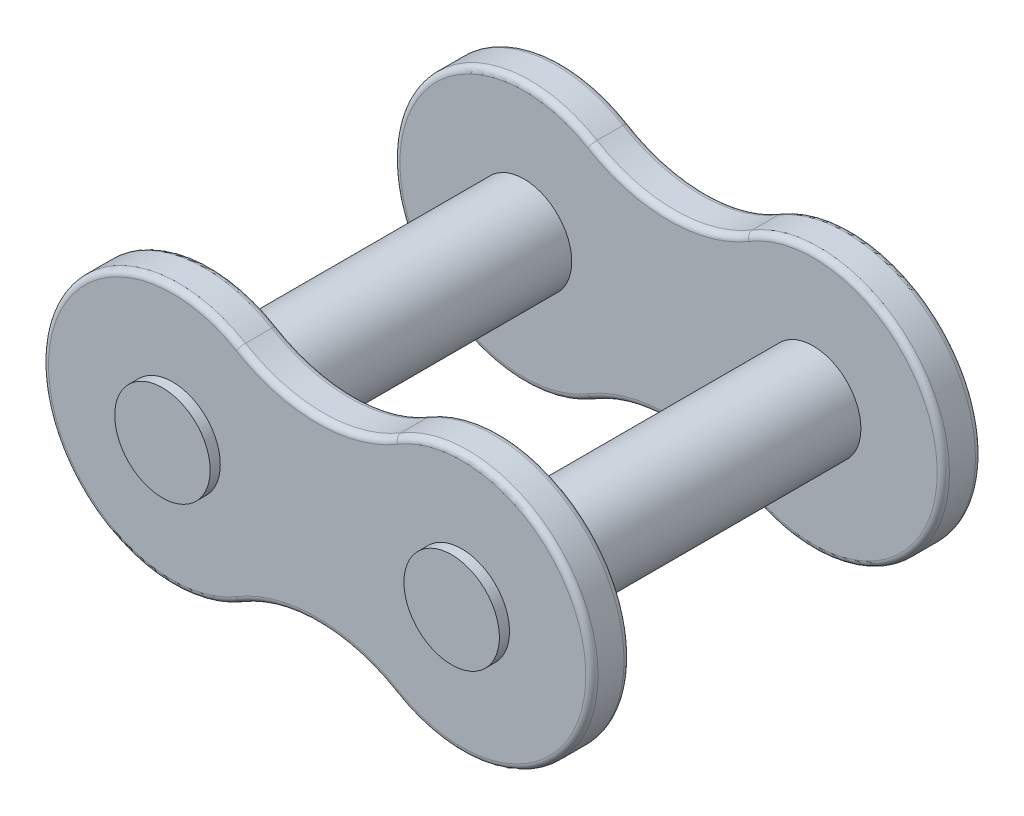
ISO-10303-21;
HEADER;
FILE_DESCRIPTION(('STEP AP214'),'2;1');
FILE_NAME('part.step','',(''),(''),'','','');
FILE_SCHEMA(('AUTOMOTIVE_DESIGN { 1 0 10303 214 1 1 1 1 }'));
ENDSEC;
DATA;
#1=APPLICATION_CONTEXT('core data for automotive mechanical design processes');
#2=APPLICATION_PROTOCOL_DEFINITION('international standard','automotive_design',2000,#1);
#3=PRODUCT_CONTEXT('',#1,'mechanical');
#4=PRODUCT('Part','Part','',(#3));
#5=PRODUCT_RELATED_PRODUCT_CATEGORY('part','',(#4));
#6=PRODUCT_DEFINITION_FORMATION('','',#4);
#7=PRODUCT_DEFINITION_CONTEXT('part definition',#1,'design');
#8=PRODUCT_DEFINITION('design','',#6,#7);
#9=PRODUCT_DEFINITION_SHAPE('','',#8);
#10=(LENGTH_UNIT() NAMED_UNIT(*) SI_UNIT(.MILLI.,.METRE.));
#11=(NAMED_UNIT(*) PLANE_ANGLE_UNIT() SI_UNIT($,.RADIAN.));
#12=(NAMED_UNIT(*) SI_UNIT($,.STERADIAN.) SOLID_ANGLE_UNIT());
#13=UNCERTAINTY_MEASURE_WITH_UNIT(LENGTH_MEASURE(1.E-05),#10,'distance_accuracy_value','');
#14=(GEOMETRIC_REPRESENTATION_CONTEXT(3) GLOBAL_UNCERTAINTY_ASSIGNED_CONTEXT((#13)) GLOBAL_UNIT_ASSIGNED_CONTEXT((#10,
#11,#12)) REPRESENTATION_CONTEXT('',''));
#15=CARTESIAN_POINT('',(0.,0.,0.));
#16=DIRECTION('',(0.,0.,1.));
#17=DIRECTION('',(1.,0.,0.));
#18=AXIS2_PLACEMENT_3D('',#15,#16,#17);
#19=CARTESIAN_POINT('',(-3.,5.00001063335668,1.5875));
#20=DIRECTION('',(0.,0.,-1.));
#21=DIRECTION('',(-1.,0.,0.));
#22=AXIS2_PLACEMENT_3D('',#19,#20,#21);
#23=PLANE('',#22);
#24=CARTESIAN_POINT('',(0.,-10.0000212667134,1.5875));
#25=DIRECTION('',(0.,0.,-1.));
#26=DIRECTION('',(-1.,0.,0.));
#27=AXIS2_PLACEMENT_3D('',#24,#25,#26);
#28=CIRCLE('',#27,6.51592202575199);
#29=CARTESIAN_POINT('',(-3.35240898268576,-4.4126610797836,1.5875));
#30=VERTEX_POINT('',#29);
#31=CARTESIAN_POINT('',(3.35240898268577,-4.4126610797836,1.5875));
#32=VERTEX_POINT('',#31);
#33=EDGE_CURVE('E174',#30,#32,#28,.T.);
#34=ORIENTED_EDGE('',*,*,#33,.T.);
#35=CARTESIAN_POINT('',(6.,0.,1.5875));
#36=DIRECTION('',(0.,0.,-1.));
#37=DIRECTION('',(-1.,0.,0.));
#38=AXIS2_PLACEMENT_3D('',#35,#36,#37);
#39=CIRCLE('',#38,5.146);
#40=CARTESIAN_POINT('',(3.35240898268577,4.4126610797836,1.5875));
#41=VERTEX_POINT('',#40);
#42=EDGE_CURVE('E154',#32,#41,#39,.F.);
#43=ORIENTED_EDGE('',*,*,#42,.T.);
#44=CARTESIAN_POINT('',(0.,10.0000212667134,1.5875));
#45=DIRECTION('',(0.,0.,-1.));
#46=DIRECTION('',(-1.,0.,0.));
#47=AXIS2_PLACEMENT_3D('',#44,#45,#46);
#48=CIRCLE('',#47,6.51592202575199);
#49=CARTESIAN_POINT('',(-3.35240898268577,4.4126610797836,1.5875));
#50=VERTEX_POINT('',#49);
#51=EDGE_CURVE('E163',#41,#50,#48,.T.);
#52=ORIENTED_EDGE('',*,*,#51,.T.);
#53=CARTESIAN_POINT('',(-6.,0.,1.5875));
#54=DIRECTION('',(0.,0.,-1.));
#55=DIRECTION('',(-1.,0.,0.));
#56=AXIS2_PLACEMENT_3D('',#53,#54,#55);
#57=CIRCLE('',#56,5.146);
#58=EDGE_CURVE('E169',#50,#30,#57,.F.);
#59=ORIENTED_EDGE('',*,*,#58,.T.);
#60=EDGE_LOOP('',(#34,#43,#52,#59));
#61=FACE_BOUND('',#60,.T.);
#62=CARTESIAN_POINT('',(-6.,0.,1.5875));
#63=DIRECTION('',(0.,0.,1.));
#64=DIRECTION('',(1.,0.,0.));
#65=AXIS2_PLACEMENT_3D('',#62,#63,#64);
#66=CIRCLE('',#65,1.98);
#67=CARTESIAN_POINT('',(-4.02,0.,1.5875));
#68=VERTEX_POINT('',#67);
#69=EDGE_CURVE('E321',#68,#68,#66,.T.);
#70=ORIENTED_EDGE('',*,*,#69,.F.);
#71=EDGE_LOOP('',(#70));
#72=FACE_BOUND('',#71,.T.);
#73=CARTESIAN_POINT('',(6.,0.,1.5875));
#74=DIRECTION('',(0.,0.,1.));
#75=DIRECTION('',(-1.,0.,0.));
#76=AXIS2_PLACEMENT_3D('',#73,#74,#75);
#77=CIRCLE('',#76,1.98);
#78=CARTESIAN_POINT('',(4.02,0.,1.5875));
#79=VERTEX_POINT('',#78);
#80=EDGE_CURVE('E318',#79,#79,#77,.T.);
#81=ORIENTED_EDGE('',*,*,#80,.F.);
#82=EDGE_LOOP('',(#81));
#83=FACE_BOUND('',#82,.T.);
#84=ADVANCED_FACE('F33',(#61,#72,#83),#23,.F.);
#85=CARTESIAN_POINT('',(-3.,5.00001063335668,0.));
#86=DIRECTION('',(0.,0.,-1.));
#87=DIRECTION('',(-1.,0.,0.));
#88=AXIS2_PLACEMENT_3D('',#85,#86,#87);
#89=PLANE('',#88);
#90=CARTESIAN_POINT('',(0.,10.0000212667134,0.));
#91=DIRECTION('',(0.,0.,-1.));
#92=DIRECTION('',(-1.,0.,0.));
#93=AXIS2_PLACEMENT_3D('',#90,#91,#92);
#94=CIRCLE('',#93,6.51592202575199);
#95=CARTESIAN_POINT('',(-3.35240898268577,4.4126610797836,0.));
#96=VERTEX_POINT('',#95);
#97=CARTESIAN_POINT('',(3.35240898268577,4.4126610797836,0.));
#98=VERTEX_POINT('',#97);
#99=EDGE_CURVE('E192',#96,#98,#94,.F.);
#100=ORIENTED_EDGE('',*,*,#99,.T.);
#101=CARTESIAN_POINT('',(6.,0.,0.));
#102=DIRECTION('',(0.,0.,-1.));
#103=DIRECTION('',(-1.,0.,0.));
#104=AXIS2_PLACEMENT_3D('',#101,#102,#103);
#105=CIRCLE('',#104,5.146);
#106=CARTESIAN_POINT('',(3.35240898268577,-4.4126610797836,0.));
#107=VERTEX_POINT('',#106);
#108=EDGE_CURVE('E198',#98,#107,#105,.T.);
#109=ORIENTED_EDGE('',*,*,#108,.T.);
#110=CARTESIAN_POINT('',(0.,-10.0000212667134,0.));
#111=DIRECTION('',(0.,0.,-1.));
#112=DIRECTION('',(-1.,0.,0.));
#113=AXIS2_PLACEMENT_3D('',#110,#111,#112);
#114=CIRCLE('',#113,6.51592202575199);
#115=CARTESIAN_POINT('',(-3.35240898268576,-4.4126610797836,0.));
#116=VERTEX_POINT('',#115);
#117=EDGE_CURVE('E196',#107,#116,#114,.F.);
#118=ORIENTED_EDGE('',*,*,#117,.T.);
#119=CARTESIAN_POINT('',(-6.,0.,0.));
#120=DIRECTION('',(0.,0.,-1.));
#121=DIRECTION('',(-1.,0.,0.));
#122=AXIS2_PLACEMENT_3D('',#119,#120,#121);
#123=CIRCLE('',#122,5.146);
#124=EDGE_CURVE('E194',#116,#96,#123,.T.);
#125=ORIENTED_EDGE('',*,*,#124,.T.);
#126=EDGE_LOOP('',(#100,#109,#118,#125));
#127=FACE_BOUND('',#126,.T.);
#128=CARTESIAN_POINT('',(-6.,0.,0.));
#129=DIRECTION('',(0.,0.,-1.));
#130=DIRECTION('',(-1.,0.,0.));
#131=AXIS2_PLACEMENT_3D('',#128,#129,#130);
#132=CIRCLE('',#131,1.98);
#133=CARTESIAN_POINT('',(-7.98,0.,0.));
#134=VERTEX_POINT('',#133);
#135=EDGE_CURVE('E306',#134,#134,#132,.F.);
#136=ORIENTED_EDGE('',*,*,#135,.T.);
#137=EDGE_LOOP('',(#136));
#138=FACE_BOUND('',#137,.T.);
#139=CARTESIAN_POINT('',(6.,0.,0.));
#140=DIRECTION('',(0.,0.,-1.));
#141=DIRECTION('',(-1.,0.,0.));
#142=AXIS2_PLACEMENT_3D('',#139,#140,#141);
#143=CIRCLE('',#142,1.98);
#144=CARTESIAN_POINT('',(4.02,0.,0.));
#145=VERTEX_POINT('',#144);
#146=EDGE_CURVE('E315',#145,#145,#143,.T.);
#147=ORIENTED_EDGE('',*,*,#146,.F.);
#148=EDGE_LOOP('',(#147));
#149=FACE_BOUND('',#148,.T.);
#150=ADVANCED_FACE('F380',(#127,#138,#149),#89,.T.);
#151=CARTESIAN_POINT('',(0.,10.0000212667134,1.5875));
#152=DIRECTION('',(0.,0.,-1.));
#153=DIRECTION('',(-1.,0.,0.));
#154=AXIS2_PLACEMENT_3D('',#151,#152,#153);
#155=CYLINDRICAL_SURFACE('',#154,6.26192202575199);
#156=DIRECTION('',(0.,0.,-1.));
#157=VECTOR('',#156,1.);
#158=CARTESIAN_POINT('',(-3.22172726515801,4.63046440552496,1.5875));
#159=LINE('',#158,#157);
#160=CARTESIAN_POINT('',(-3.22172726515801,4.63046440552496,1.3335));
#161=VERTEX_POINT('',#160);
#162=CARTESIAN_POINT('',(-3.22172726515801,4.63046440552496,0.254));
#163=VERTEX_POINT('',#162);
#164=EDGE_CURVE('E333',#161,#163,#159,.T.);
#165=ORIENTED_EDGE('',*,*,#164,.F.);
#166=CARTESIAN_POINT('',(0.,10.0000212667134,1.3335));
#167=DIRECTION('',(0.,0.,-1.));
#168=DIRECTION('',(-1.,0.,0.));
#169=AXIS2_PLACEMENT_3D('',#166,#167,#168);
#170=CIRCLE('',#169,6.26192202575199);
#171=CARTESIAN_POINT('',(3.22172726515801,4.63046440552496,1.3335));
#172=VERTEX_POINT('',#171);
#173=EDGE_CURVE('E233',#161,#172,#170,.F.);
#174=ORIENTED_EDGE('',*,*,#173,.T.);
#175=DIRECTION('',(0.,0.,-1.));
#176=VECTOR('',#175,1.);
#177=CARTESIAN_POINT('',(3.22172726515801,4.63046440552496,1.5875));
#178=LINE('',#177,#176);
#179=CARTESIAN_POINT('',(3.22172726515801,4.63046440552496,0.254));
#180=VERTEX_POINT('',#179);
#181=EDGE_CURVE('E324',#172,#180,#178,.T.);
#182=ORIENTED_EDGE('',*,*,#181,.T.);
#183=CARTESIAN_POINT('',(0.,10.0000212667134,0.254));
#184=DIRECTION('',(0.,0.,-1.));
#185=DIRECTION('',(-1.,0.,0.));
#186=AXIS2_PLACEMENT_3D('',#183,#184,#185);
#187=CIRCLE('',#186,6.26192202575199);
#188=EDGE_CURVE('E231',#180,#163,#187,.T.);
#189=ORIENTED_EDGE('',*,*,#188,.T.);
#190=EDGE_LOOP('',(#165,#174,#182,#189));
#191=FACE_BOUND('',#190,.T.);
#192=ADVANCED_FACE('F368',(#191),#155,.F.);
#193=CARTESIAN_POINT('',(-6.,0.,1.5875));
#194=DIRECTION('',(0.,0.,-1.));
#195=DIRECTION('',(-1.,0.,0.));
#196=AXIS2_PLACEMENT_3D('',#193,#194,#195);
#197=CYLINDRICAL_SURFACE('',#196,5.4);
#198=DIRECTION('',(0.,0.,-1.));
#199=VECTOR('',#198,1.);
#200=CARTESIAN_POINT('',(-3.22172726515801,-4.63046440552496,1.5875));
#201=LINE('',#200,#199);
#202=CARTESIAN_POINT('',(-3.22172726515801,-4.63046440552496,1.3335));
#203=VERTEX_POINT('',#202);
#204=CARTESIAN_POINT('',(-3.22172726515801,-4.63046440552496,0.254));
#205=VERTEX_POINT('',#204);
#206=EDGE_CURVE('E330',#203,#205,#201,.T.);
#207=ORIENTED_EDGE('',*,*,#206,.F.);
#208=CARTESIAN_POINT('',(-6.,0.,1.3335));
#209=DIRECTION('',(0.,0.,-1.));
#210=DIRECTION('',(-1.,0.,0.));
#211=AXIS2_PLACEMENT_3D('',#208,#209,#210);
#212=CIRCLE('',#211,5.4);
#213=EDGE_CURVE('E190',#203,#161,#212,.T.);
#214=ORIENTED_EDGE('',*,*,#213,.T.);
#215=ORIENTED_EDGE('',*,*,#164,.T.);
#216=CARTESIAN_POINT('',(-6.,0.,0.254));
#217=DIRECTION('',(0.,0.,-1.));
#218=DIRECTION('',(-1.,0.,0.));
#219=AXIS2_PLACEMENT_3D('',#216,#217,#218);
#220=CIRCLE('',#219,5.4);
#221=EDGE_CURVE('E188',#163,#205,#220,.F.);
#222=ORIENTED_EDGE('',*,*,#221,.T.);
#223=EDGE_LOOP('',(#207,#214,#215,#222));
#224=FACE_BOUND('',#223,.T.);
#225=ADVANCED_FACE('F371',(#224),#197,.T.);
#226=CARTESIAN_POINT('',(0.,-10.0000212667134,1.5875));
#227=DIRECTION('',(0.,0.,-1.));
#228=DIRECTION('',(-1.,0.,0.));
#229=AXIS2_PLACEMENT_3D('',#226,#227,#228);
#230=CYLINDRICAL_SURFACE('',#229,6.26192202575199);
#231=DIRECTION('',(0.,0.,-1.));
#232=VECTOR('',#231,1.);
#233=CARTESIAN_POINT('',(3.22172726515802,-4.63046440552496,1.5875));
#234=LINE('',#233,#232);
#235=CARTESIAN_POINT('',(3.22172726515802,-4.63046440552496,1.3335));
#236=VERTEX_POINT('',#235);
#237=CARTESIAN_POINT('',(3.22172726515802,-4.63046440552496,0.254));
#238=VERTEX_POINT('',#237);
#239=EDGE_CURVE('E327',#236,#238,#234,.T.);
#240=ORIENTED_EDGE('',*,*,#239,.F.);
#241=CARTESIAN_POINT('',(0.,-10.0000212667134,1.3335));
#242=DIRECTION('',(0.,0.,-1.));
#243=DIRECTION('',(-1.,0.,0.));
#244=AXIS2_PLACEMENT_3D('',#241,#242,#243);
#245=CIRCLE('',#244,6.26192202575199);
#246=EDGE_CURVE('E186',#236,#203,#245,.F.);
#247=ORIENTED_EDGE('',*,*,#246,.T.);
#248=ORIENTED_EDGE('',*,*,#206,.T.);
#249=CARTESIAN_POINT('',(0.,-10.0000212667134,0.254));
#250=DIRECTION('',(0.,0.,-1.));
#251=DIRECTION('',(-1.,0.,0.));
#252=AXIS2_PLACEMENT_3D('',#249,#250,#251);
#253=CIRCLE('',#252,6.26192202575199);
#254=EDGE_CURVE('E184',#205,#238,#253,.T.);
#255=ORIENTED_EDGE('',*,*,#254,.T.);
#256=EDGE_LOOP('',(#240,#247,#248,#255));
#257=FACE_BOUND('',#256,.T.);
#258=ADVANCED_FACE('F354',(#257),#230,.F.);
#259=CARTESIAN_POINT('',(6.,0.,1.5875));
#260=DIRECTION('',(0.,0.,-1.));
#261=DIRECTION('',(-1.,0.,0.));
#262=AXIS2_PLACEMENT_3D('',#259,#260,#261);
#263=CYLINDRICAL_SURFACE('',#262,5.4);
#264=ORIENTED_EDGE('',*,*,#181,.F.);
#265=CARTESIAN_POINT('',(6.,0.,1.3335));
#266=DIRECTION('',(0.,0.,-1.));
#267=DIRECTION('',(-1.,0.,0.));
#268=AXIS2_PLACEMENT_3D('',#265,#266,#267);
#269=CIRCLE('',#268,5.4);
#270=EDGE_CURVE('E156',#172,#236,#269,.T.);
#271=ORIENTED_EDGE('',*,*,#270,.T.);
#272=ORIENTED_EDGE('',*,*,#239,.T.);
#273=CARTESIAN_POINT('',(6.,0.,0.254));
#274=DIRECTION('',(0.,0.,-1.));
#275=DIRECTION('',(-1.,0.,0.));
#276=AXIS2_PLACEMENT_3D('',#273,#274,#275);
#277=CIRCLE('',#276,5.4);
#278=EDGE_CURVE('E176',#238,#180,#277,.F.);
#279=ORIENTED_EDGE('',*,*,#278,.T.);
#280=EDGE_LOOP('',(#264,#271,#272,#279));
#281=FACE_BOUND('',#280,.T.);
#282=ADVANCED_FACE('F352',(#281),#263,.T.);
#283=CARTESIAN_POINT('',(6.,0.,2.0075));
#284=DIRECTION('',(0.,0.,-1.));
#285=DIRECTION('',(-1.,0.,0.));
#286=AXIS2_PLACEMENT_3D('',#283,#284,#285);
#287=CYLINDRICAL_SURFACE('',#286,1.98);
#288=CARTESIAN_POINT('',(6.,0.,-12.9925));
#289=DIRECTION('',(0.,0.,1.));
#290=DIRECTION('',(1.,0.,0.));
#291=AXIS2_PLACEMENT_3D('',#288,#289,#290);
#292=CIRCLE('',#291,1.98);
#293=CARTESIAN_POINT('',(7.98,0.,-12.9925));
#294=VERTEX_POINT('',#293);
#295=EDGE_CURVE('E170',#294,#294,#292,.F.);
#296=ORIENTED_EDGE('',*,*,#295,.F.);
#297=EDGE_LOOP('',(#296));
#298=FACE_BOUND('',#297,.T.);
#299=ORIENTED_EDGE('',*,*,#146,.T.);
#300=EDGE_LOOP('',(#299));
#301=FACE_BOUND('',#300,.T.);
#302=ADVANCED_FACE('F388',(#298,#301),#287,.T.);
#303=CARTESIAN_POINT('',(6.,0.,2.0075));
#304=DIRECTION('',(0.,0.,-1.));
#305=DIRECTION('',(-1.,0.,0.));
#306=AXIS2_PLACEMENT_3D('',#303,#304,#305);
#307=CIRCLE('',#306,1.98);
#308=CARTESIAN_POINT('',(4.02,0.,2.0075));
#309=VERTEX_POINT('',#308);
#310=EDGE_CURVE('E312',#309,#309,#307,.T.);
#311=ORIENTED_EDGE('',*,*,#310,.T.);
#312=EDGE_LOOP('',(#311));
#313=FACE_BOUND('',#312,.T.);
#314=ORIENTED_EDGE('',*,*,#80,.T.);
#315=EDGE_LOOP('',(#314));
#316=FACE_BOUND('',#315,.T.);
#317=ADVANCED_FACE('F390',(#313,#316),#287,.T.);
#318=CARTESIAN_POINT('',(6.,0.,2.0075));
#319=DIRECTION('',(0.,0.,-1.));
#320=DIRECTION('',(-1.,0.,0.));
#321=AXIS2_PLACEMENT_3D('',#318,#319,#320);
#322=PLANE('',#321);
#323=ORIENTED_EDGE('',*,*,#310,.F.);
#324=EDGE_LOOP('',(#323));
#325=FACE_BOUND('',#324,.T.);
#326=ADVANCED_FACE('F398',(#325),#322,.F.);
#327=CARTESIAN_POINT('',(-6.,0.,2.0075));
#328=DIRECTION('',(0.,0.,-1.));
#329=DIRECTION('',(-1.,0.,0.));
#330=AXIS2_PLACEMENT_3D('',#327,#328,#329);
#331=CYLINDRICAL_SURFACE('',#330,1.98);
#332=CARTESIAN_POINT('',(-6.,0.,-12.9925));
#333=DIRECTION('',(0.,0.,1.));
#334=DIRECTION('',(1.,0.,0.));
#335=AXIS2_PLACEMENT_3D('',#332,#333,#334);
#336=CIRCLE('',#335,1.98);
#337=CARTESIAN_POINT('',(-4.02,0.,-12.9925));
#338=VERTEX_POINT('',#337);
#339=EDGE_CURVE('E726',#338,#338,#336,.T.);
#340=ORIENTED_EDGE('',*,*,#339,.T.);
#341=EDGE_LOOP('',(#340));
#342=FACE_BOUND('',#341,.T.);
#343=ORIENTED_EDGE('',*,*,#135,.F.);
#344=EDGE_LOOP('',(#343));
#345=FACE_BOUND('',#344,.T.);
#346=ADVANCED_FACE('F530',(#342,#345),#331,.T.);
#347=CARTESIAN_POINT('',(-6.,0.,2.0075));
#348=DIRECTION('',(0.,0.,1.));
#349=DIRECTION('',(1.,0.,0.));
#350=AXIS2_PLACEMENT_3D('',#347,#348,#349);
#351=CIRCLE('',#350,1.98);
#352=CARTESIAN_POINT('',(-4.02,0.,2.0075));
#353=VERTEX_POINT('',#352);
#354=EDGE_CURVE('E298',#353,#353,#351,.T.);
#355=ORIENTED_EDGE('',*,*,#354,.F.);
#356=EDGE_LOOP('',(#355));
#357=FACE_BOUND('',#356,.T.);
#358=ORIENTED_EDGE('',*,*,#69,.T.);
#359=EDGE_LOOP('',(#358));
#360=FACE_BOUND('',#359,.T.);
#361=ADVANCED_FACE('F529',(#357,#360),#331,.T.);
#362=CARTESIAN_POINT('',(-6.,0.,2.0075));
#363=DIRECTION('',(0.,0.,-1.));
#364=DIRECTION('',(1.,0.,0.));
#365=AXIS2_PLACEMENT_3D('',#362,#363,#364);
#366=PLANE('',#365);
#367=ORIENTED_EDGE('',*,*,#354,.T.);
#368=EDGE_LOOP('',(#367));
#369=FACE_BOUND('',#368,.T.);
#370=ADVANCED_FACE('F581',(#369),#366,.F.);
#371=CARTESIAN_POINT('',(0.,10.0000212667134,-14.58));
#372=DIRECTION('',(0.,0.,1.));
#373=DIRECTION('',(1.,0.,0.));
#374=AXIS2_PLACEMENT_3D('',#371,#372,#373);
#375=CYLINDRICAL_SURFACE('',#374,6.26192202575199);
#376=DIRECTION('',(0.,0.,1.));
#377=VECTOR('',#376,1.);
#378=CARTESIAN_POINT('',(-3.22172726515801,4.63046440552496,-14.58));
#379=LINE('',#378,#377);
#380=CARTESIAN_POINT('',(-3.22172726515801,4.63046440552496,-14.326));
#381=VERTEX_POINT('',#380);
#382=CARTESIAN_POINT('',(-3.22172726515801,4.63046440552496,-13.2465));
#383=VERTEX_POINT('',#382);
#384=EDGE_CURVE('E728',#381,#383,#379,.T.);
#385=ORIENTED_EDGE('',*,*,#384,.T.);
#386=CARTESIAN_POINT('',(0.,10.0000212667134,-13.2465));
#387=DIRECTION('',(0.,0.,1.));
#388=DIRECTION('',(1.,0.,0.));
#389=AXIS2_PLACEMENT_3D('',#386,#387,#388);
#390=CIRCLE('',#389,6.26192202575199);
#391=CARTESIAN_POINT('',(3.22172726515801,4.63046440552496,-13.2465));
#392=VERTEX_POINT('',#391);
#393=EDGE_CURVE('E11',#383,#392,#390,.T.);
#394=ORIENTED_EDGE('',*,*,#393,.T.);
#395=DIRECTION('',(0.,0.,1.));
#396=VECTOR('',#395,1.);
#397=CARTESIAN_POINT('',(3.22172726515801,4.63046440552496,-14.58));
#398=LINE('',#397,#396);
#399=CARTESIAN_POINT('',(3.22172726515801,4.63046440552496,-14.326));
#400=VERTEX_POINT('',#399);
#401=EDGE_CURVE('E289',#400,#392,#398,.T.);
#402=ORIENTED_EDGE('',*,*,#401,.F.);
#403=CARTESIAN_POINT('',(0.,10.0000212667134,-14.326));
#404=DIRECTION('',(0.,0.,1.));
#405=DIRECTION('',(1.,0.,0.));
#406=AXIS2_PLACEMENT_3D('',#403,#404,#405);
#407=CIRCLE('',#406,6.26192202575199);
#408=EDGE_CURVE('E42',#400,#381,#407,.F.);
#409=ORIENTED_EDGE('',*,*,#408,.T.);
#410=EDGE_LOOP('',(#385,#394,#402,#409));
#411=FACE_BOUND('',#410,.T.);
#412=ADVANCED_FACE('F293',(#411),#375,.F.);
#413=CARTESIAN_POINT('',(6.,0.,-14.58));
#414=DIRECTION('',(0.,0.,1.));
#415=DIRECTION('',(1.,0.,0.));
#416=AXIS2_PLACEMENT_3D('',#413,#414,#415);
#417=CYLINDRICAL_SURFACE('',#416,5.4);
#418=ORIENTED_EDGE('',*,*,#401,.T.);
#419=CARTESIAN_POINT('',(6.,0.,-13.2465));
#420=DIRECTION('',(0.,0.,1.));
#421=DIRECTION('',(1.,0.,0.));
#422=AXIS2_PLACEMENT_3D('',#419,#420,#421);
#423=CIRCLE('',#422,5.4);
#424=CARTESIAN_POINT('',(3.22172726515802,-4.63046440552496,-13.2465));
#425=VERTEX_POINT('',#424);
#426=EDGE_CURVE('E213',#392,#425,#423,.F.);
#427=ORIENTED_EDGE('',*,*,#426,.T.);
#428=DIRECTION('',(0.,0.,1.));
#429=VECTOR('',#428,1.);
#430=CARTESIAN_POINT('',(3.22172726515802,-4.63046440552496,-14.58));
#431=LINE('',#430,#429);
#432=CARTESIAN_POINT('',(3.22172726515802,-4.63046440552496,-14.326));
#433=VERTEX_POINT('',#432);
#434=EDGE_CURVE('E292',#433,#425,#431,.T.);
#435=ORIENTED_EDGE('',*,*,#434,.F.);
#436=CARTESIAN_POINT('',(6.,0.,-14.326));
#437=DIRECTION('',(0.,0.,1.));
#438=DIRECTION('',(1.,0.,0.));
#439=AXIS2_PLACEMENT_3D('',#436,#437,#438);
#440=CIRCLE('',#439,5.4);
#441=EDGE_CURVE('E210',#433,#400,#440,.T.);
#442=ORIENTED_EDGE('',*,*,#441,.T.);
#443=EDGE_LOOP('',(#418,#427,#435,#442));
#444=FACE_BOUND('',#443,.T.);
#445=ADVANCED_FACE('F288',(#444),#417,.T.);
#446=CARTESIAN_POINT('',(0.,-10.0000212667134,-14.58));
#447=DIRECTION('',(0.,0.,1.));
#448=DIRECTION('',(1.,0.,0.));
#449=AXIS2_PLACEMENT_3D('',#446,#447,#448);
#450=CYLINDRICAL_SURFACE('',#449,6.26192202575199);
#451=ORIENTED_EDGE('',*,*,#434,.T.);
#452=CARTESIAN_POINT('',(0.,-10.0000212667134,-13.2465));
#453=DIRECTION('',(0.,0.,1.));
#454=DIRECTION('',(1.,0.,0.));
#455=AXIS2_PLACEMENT_3D('',#452,#453,#454);
#456=CIRCLE('',#455,6.26192202575199);
#457=CARTESIAN_POINT('',(-3.22172726515801,-4.63046440552496,-13.2465));
#458=VERTEX_POINT('',#457);
#459=EDGE_CURVE('E218',#425,#458,#456,.T.);
#460=ORIENTED_EDGE('',*,*,#459,.T.);
#461=DIRECTION('',(0.,0.,1.));
#462=VECTOR('',#461,1.);
#463=CARTESIAN_POINT('',(-3.22172726515801,-4.63046440552496,-14.58));
#464=LINE('',#463,#462);
#465=CARTESIAN_POINT('',(-3.22172726515801,-4.63046440552496,-14.326));
#466=VERTEX_POINT('',#465);
#467=EDGE_CURVE('E300',#466,#458,#464,.T.);
#468=ORIENTED_EDGE('',*,*,#467,.F.);
#469=CARTESIAN_POINT('',(0.,-10.0000212667134,-14.326));
#470=DIRECTION('',(0.,0.,1.));
#471=DIRECTION('',(1.,0.,0.));
#472=AXIS2_PLACEMENT_3D('',#469,#470,#471);
#473=CIRCLE('',#472,6.26192202575199);
#474=EDGE_CURVE('E216',#466,#433,#473,.F.);
#475=ORIENTED_EDGE('',*,*,#474,.T.);
#476=EDGE_LOOP('',(#451,#460,#468,#475));
#477=FACE_BOUND('',#476,.T.);
#478=ADVANCED_FACE('F560',(#477),#450,.F.);
#479=CARTESIAN_POINT('',(-6.,0.,-14.58));
#480=DIRECTION('',(0.,0.,1.));
#481=DIRECTION('',(1.,0.,0.));
#482=AXIS2_PLACEMENT_3D('',#479,#480,#481);
#483=CYLINDRICAL_SURFACE('',#482,5.4);
#484=ORIENTED_EDGE('',*,*,#467,.T.);
#485=CARTESIAN_POINT('',(-6.,0.,-13.2465));
#486=DIRECTION('',(0.,0.,1.));
#487=DIRECTION('',(1.,0.,0.));
#488=AXIS2_PLACEMENT_3D('',#485,#486,#487);
#489=CIRCLE('',#488,5.4);
#490=EDGE_CURVE('E222',#458,#383,#489,.F.);
#491=ORIENTED_EDGE('',*,*,#490,.T.);
#492=ORIENTED_EDGE('',*,*,#384,.F.);
#493=CARTESIAN_POINT('',(-6.,0.,-14.326));
#494=DIRECTION('',(0.,0.,1.));
#495=DIRECTION('',(1.,0.,0.));
#496=AXIS2_PLACEMENT_3D('',#493,#494,#495);
#497=CIRCLE('',#496,5.4);
#498=EDGE_CURVE('E220',#381,#466,#497,.T.);
#499=ORIENTED_EDGE('',*,*,#498,.T.);
#500=EDGE_LOOP('',(#484,#491,#492,#499));
#501=FACE_BOUND('',#500,.T.);
#502=ADVANCED_FACE('F553',(#501),#483,.T.);
#503=CARTESIAN_POINT('',(-3.,5.00001063335668,-14.58));
#504=DIRECTION('',(0.,0.,1.));
#505=DIRECTION('',(-1.,0.,0.));
#506=AXIS2_PLACEMENT_3D('',#503,#504,#505);
#507=PLANE('',#506);
#508=CARTESIAN_POINT('',(0.,10.0000212667134,-14.58));
#509=DIRECTION('',(0.,0.,1.));
#510=DIRECTION('',(1.,0.,0.));
#511=AXIS2_PLACEMENT_3D('',#508,#509,#510);
#512=CIRCLE('',#511,6.51592202575199);
#513=CARTESIAN_POINT('',(-3.35240898268577,4.4126610797836,-14.58));
#514=VERTEX_POINT('',#513);
#515=CARTESIAN_POINT('',(3.35240898268577,4.4126610797836,-14.58));
#516=VERTEX_POINT('',#515);
#517=EDGE_CURVE('E224',#514,#516,#512,.T.);
#518=ORIENTED_EDGE('',*,*,#517,.T.);
#519=CARTESIAN_POINT('',(6.,0.,-14.58));
#520=DIRECTION('',(0.,0.,1.));
#521=DIRECTION('',(1.,0.,0.));
#522=AXIS2_PLACEMENT_3D('',#519,#520,#521);
#523=CIRCLE('',#522,5.146);
#524=CARTESIAN_POINT('',(3.35240898268577,-4.4126610797836,-14.58));
#525=VERTEX_POINT('',#524);
#526=EDGE_CURVE('E229',#516,#525,#523,.F.);
#527=ORIENTED_EDGE('',*,*,#526,.T.);
#528=CARTESIAN_POINT('',(0.,-10.0000212667134,-14.58));
#529=DIRECTION('',(0.,0.,1.));
#530=DIRECTION('',(1.,0.,0.));
#531=AXIS2_PLACEMENT_3D('',#528,#529,#530);
#532=CIRCLE('',#531,6.51592202575199);
#533=CARTESIAN_POINT('',(-3.35240898268576,-4.4126610797836,-14.58));
#534=VERTEX_POINT('',#533);
#535=EDGE_CURVE('E57',#525,#534,#532,.T.);
#536=ORIENTED_EDGE('',*,*,#535,.T.);
#537=CARTESIAN_POINT('',(-6.,0.,-14.58));
#538=DIRECTION('',(0.,0.,1.));
#539=DIRECTION('',(1.,0.,0.));
#540=AXIS2_PLACEMENT_3D('',#537,#538,#539);
#541=CIRCLE('',#540,5.146);
#542=EDGE_CURVE('E226',#534,#514,#541,.F.);
#543=ORIENTED_EDGE('',*,*,#542,.T.);
#544=EDGE_LOOP('',(#518,#527,#536,#543));
#545=FACE_BOUND('',#544,.T.);
#546=CARTESIAN_POINT('',(6.,0.,-14.58));
#547=DIRECTION('',(0.,0.,1.));
#548=DIRECTION('',(-1.,0.,0.));
#549=AXIS2_PLACEMENT_3D('',#546,#547,#548);
#550=CIRCLE('',#549,1.98);
#551=CARTESIAN_POINT('',(4.02,0.,-14.58));
#552=VERTEX_POINT('',#551);
#553=EDGE_CURVE('E241',#552,#552,#550,.T.);
#554=ORIENTED_EDGE('',*,*,#553,.T.);
#555=EDGE_LOOP('',(#554));
#556=FACE_BOUND('',#555,.T.);
#557=CARTESIAN_POINT('',(-6.,0.,-14.58));
#558=DIRECTION('',(0.,0.,1.));
#559=DIRECTION('',(1.,0.,0.));
#560=AXIS2_PLACEMENT_3D('',#557,#558,#559);
#561=CIRCLE('',#560,1.98);
#562=CARTESIAN_POINT('',(-4.02,0.,-14.58));
#563=VERTEX_POINT('',#562);
#564=EDGE_CURVE('E336',#563,#563,#561,.T.);
#565=ORIENTED_EDGE('',*,*,#564,.T.);
#566=EDGE_LOOP('',(#565));
#567=FACE_BOUND('',#566,.T.);
#568=ADVANCED_FACE('F276',(#545,#556,#567),#507,.F.);
#569=CARTESIAN_POINT('',(-3.,5.00001063335668,-12.9925));
#570=DIRECTION('',(0.,0.,1.));
#571=DIRECTION('',(-1.,0.,0.));
#572=AXIS2_PLACEMENT_3D('',#569,#570,#571);
#573=PLANE('',#572);
#574=CARTESIAN_POINT('',(0.,-10.0000212667134,-12.9925));
#575=DIRECTION('',(0.,0.,1.));
#576=DIRECTION('',(1.,0.,0.));
#577=AXIS2_PLACEMENT_3D('',#574,#575,#576);
#578=CIRCLE('',#577,6.51592202575199);
#579=CARTESIAN_POINT('',(-3.35240898268576,-4.4126610797836,-12.9925));
#580=VERTEX_POINT('',#579);
#581=CARTESIAN_POINT('',(3.35240898268577,-4.4126610797836,-12.9925));
#582=VERTEX_POINT('',#581);
#583=EDGE_CURVE('E205',#580,#582,#578,.F.);
#584=ORIENTED_EDGE('',*,*,#583,.T.);
#585=CARTESIAN_POINT('',(6.,0.,-12.9925));
#586=DIRECTION('',(0.,0.,1.));
#587=DIRECTION('',(1.,0.,0.));
#588=AXIS2_PLACEMENT_3D('',#585,#586,#587);
#589=CIRCLE('',#588,5.146);
#590=CARTESIAN_POINT('',(3.35240898268577,4.4126610797836,-12.9925));
#591=VERTEX_POINT('',#590);
#592=EDGE_CURVE('E207',#582,#591,#589,.T.);
#593=ORIENTED_EDGE('',*,*,#592,.T.);
#594=CARTESIAN_POINT('',(0.,10.0000212667134,-12.9925));
#595=DIRECTION('',(0.,0.,1.));
#596=DIRECTION('',(1.,0.,0.));
#597=AXIS2_PLACEMENT_3D('',#594,#595,#596);
#598=CIRCLE('',#597,6.51592202575199);
#599=CARTESIAN_POINT('',(-3.35240898268577,4.4126610797836,-12.9925));
#600=VERTEX_POINT('',#599);
#601=EDGE_CURVE('E201',#591,#600,#598,.F.);
#602=ORIENTED_EDGE('',*,*,#601,.T.);
#603=CARTESIAN_POINT('',(-6.,0.,-12.9925));
#604=DIRECTION('',(0.,0.,1.));
#605=DIRECTION('',(1.,0.,0.));
#606=AXIS2_PLACEMENT_3D('',#603,#604,#605);
#607=CIRCLE('',#606,5.146);
#608=EDGE_CURVE('E203',#600,#580,#607,.T.);
#609=ORIENTED_EDGE('',*,*,#608,.T.);
#610=EDGE_LOOP('',(#584,#593,#602,#609));
#611=FACE_BOUND('',#610,.T.);
#612=ORIENTED_EDGE('',*,*,#295,.T.);
#613=EDGE_LOOP('',(#612));
#614=FACE_BOUND('',#613,.T.);
#615=ORIENTED_EDGE('',*,*,#339,.F.);
#616=EDGE_LOOP('',(#615));
#617=FACE_BOUND('',#616,.T.);
#618=ADVANCED_FACE('F537',(#611,#614,#617),#573,.T.);
#619=CARTESIAN_POINT('',(-6.,0.,-15.));
#620=DIRECTION('',(0.,0.,-1.));
#621=DIRECTION('',(1.,0.,0.));
#622=AXIS2_PLACEMENT_3D('',#619,#620,#621);
#623=PLANE('',#622);
#624=CARTESIAN_POINT('',(-6.,0.,-15.));
#625=DIRECTION('',(0.,0.,1.));
#626=DIRECTION('',(1.,0.,0.));
#627=AXIS2_PLACEMENT_3D('',#624,#625,#626);
#628=CIRCLE('',#627,1.98);
#629=CARTESIAN_POINT('',(-4.02,0.,-15.));
#630=VERTEX_POINT('',#629);
#631=EDGE_CURVE('E295',#630,#630,#628,.T.);
#632=ORIENTED_EDGE('',*,*,#631,.F.);
#633=EDGE_LOOP('',(#632));
#634=FACE_BOUND('',#633,.T.);
#635=ADVANCED_FACE('F526',(#634),#623,.T.);
#636=ORIENTED_EDGE('',*,*,#631,.T.);
#637=EDGE_LOOP('',(#636));
#638=FACE_BOUND('',#637,.T.);
#639=ORIENTED_EDGE('',*,*,#564,.F.);
#640=EDGE_LOOP('',(#639));
#641=FACE_BOUND('',#640,.T.);
#642=ADVANCED_FACE('F518',(#638,#641),#331,.T.);
#643=CARTESIAN_POINT('',(6.,0.,-15.));
#644=DIRECTION('',(0.,0.,-1.));
#645=DIRECTION('',(-1.,0.,0.));
#646=AXIS2_PLACEMENT_3D('',#643,#644,#645);
#647=PLANE('',#646);
#648=CARTESIAN_POINT('',(6.,0.,-15.));
#649=DIRECTION('',(0.,0.,-1.));
#650=DIRECTION('',(-1.,0.,0.));
#651=AXIS2_PLACEMENT_3D('',#648,#649,#650);
#652=CIRCLE('',#651,1.98);
#653=CARTESIAN_POINT('',(4.02,0.,-15.));
#654=VERTEX_POINT('',#653);
#655=EDGE_CURVE('E309',#654,#654,#652,.T.);
#656=ORIENTED_EDGE('',*,*,#655,.T.);
#657=EDGE_LOOP('',(#656));
#658=FACE_BOUND('',#657,.T.);
#659=ADVANCED_FACE('F405',(#658),#647,.T.);
#660=ORIENTED_EDGE('',*,*,#655,.F.);
#661=EDGE_LOOP('',(#660));
#662=FACE_BOUND('',#661,.T.);
#663=ORIENTED_EDGE('',*,*,#553,.F.);
#664=EDGE_LOOP('',(#663));
#665=FACE_BOUND('',#664,.T.);
#666=ADVANCED_FACE('F393',(#662,#665),#287,.T.);
#667=CARTESIAN_POINT('',(-6.,0.,1.3335));
#668=DIRECTION('',(0.,0.,-1.));
#669=DIRECTION('',(-1.,0.,0.));
#670=AXIS2_PLACEMENT_3D('',#667,#668,#669);
#671=TOROIDAL_SURFACE('',#670,5.146,0.254);
#672=CARTESIAN_POINT('',(-3.35240898268577,4.4126610797836,1.3335));
#673=DIRECTION('',(0.857493408430548,-0.514494950896664,0.));
#674=DIRECTION('',(0.514494950896664,0.857493408430548,0.));
#675=AXIS2_PLACEMENT_3D('',#672,#673,#674);
#676=CIRCLE('',#675,0.254);
#677=EDGE_CURVE('E166',#161,#50,#676,.T.);
#678=ORIENTED_EDGE('',*,*,#677,.F.);
#679=ORIENTED_EDGE('',*,*,#213,.F.);
#680=CARTESIAN_POINT('',(-3.35240898268576,-4.4126610797836,1.3335));
#681=DIRECTION('',(0.857493408430548,0.514494950896664,0.));
#682=DIRECTION('',(-0.514494950896664,0.857493408430548,0.));
#683=AXIS2_PLACEMENT_3D('',#680,#681,#682);
#684=CIRCLE('',#683,0.254);
#685=EDGE_CURVE('E238',#30,#203,#684,.T.);
#686=ORIENTED_EDGE('',*,*,#685,.F.);
#687=ORIENTED_EDGE('',*,*,#58,.F.);
#688=EDGE_LOOP('',(#678,#679,#686,#687));
#689=FACE_BOUND('',#688,.T.);
#690=ADVANCED_FACE('F343',(#689),#671,.T.);
#691=CARTESIAN_POINT('',(0.,-10.0000212667134,1.3335));
#692=DIRECTION('',(0.,0.,-1.));
#693=DIRECTION('',(-1.,0.,0.));
#694=AXIS2_PLACEMENT_3D('',#691,#692,#693);
#695=TOROIDAL_SURFACE('',#694,6.51592202575199,0.254);
#696=ORIENTED_EDGE('',*,*,#685,.T.);
#697=ORIENTED_EDGE('',*,*,#246,.F.);
#698=CARTESIAN_POINT('',(3.35240898268577,-4.4126610797836,1.3335));
#699=DIRECTION('',(0.857493408430548,-0.514494950896664,0.));
#700=DIRECTION('',(0.514494950896664,0.857493408430548,0.));
#701=AXIS2_PLACEMENT_3D('',#698,#699,#700);
#702=CIRCLE('',#701,0.254);
#703=EDGE_CURVE('E159',#32,#236,#702,.T.);
#704=ORIENTED_EDGE('',*,*,#703,.F.);
#705=ORIENTED_EDGE('',*,*,#33,.F.);
#706=EDGE_LOOP('',(#696,#697,#704,#705));
#707=FACE_BOUND('',#706,.T.);
#708=ADVANCED_FACE('F346',(#707),#695,.T.);
#709=CARTESIAN_POINT('',(0.,10.0000212667134,1.3335));
#710=DIRECTION('',(0.,0.,-1.));
#711=DIRECTION('',(-1.,0.,0.));
#712=AXIS2_PLACEMENT_3D('',#709,#710,#711);
#713=TOROIDAL_SURFACE('',#712,6.51592202575199,0.254);
#714=ORIENTED_EDGE('',*,*,#677,.T.);
#715=ORIENTED_EDGE('',*,*,#51,.F.);
#716=CARTESIAN_POINT('',(3.35240898268577,4.4126610797836,1.3335));
#717=DIRECTION('',(0.857493408430548,0.514494950896664,0.));
#718=DIRECTION('',(-0.514494950896664,0.857493408430548,0.));
#719=AXIS2_PLACEMENT_3D('',#716,#717,#718);
#720=CIRCLE('',#719,0.254);
#721=EDGE_CURVE('E150',#172,#41,#720,.T.);
#722=ORIENTED_EDGE('',*,*,#721,.F.);
#723=ORIENTED_EDGE('',*,*,#173,.F.);
#724=EDGE_LOOP('',(#714,#715,#722,#723));
#725=FACE_BOUND('',#724,.T.);
#726=ADVANCED_FACE('F164',(#725),#713,.T.);
#727=CARTESIAN_POINT('',(6.,0.,1.3335));
#728=DIRECTION('',(0.,0.,-1.));
#729=DIRECTION('',(-1.,0.,0.));
#730=AXIS2_PLACEMENT_3D('',#727,#728,#729);
#731=TOROIDAL_SURFACE('',#730,5.146,0.254);
#732=ORIENTED_EDGE('',*,*,#703,.T.);
#733=ORIENTED_EDGE('',*,*,#270,.F.);
#734=ORIENTED_EDGE('',*,*,#721,.T.);
#735=ORIENTED_EDGE('',*,*,#42,.F.);
#736=EDGE_LOOP('',(#732,#733,#734,#735));
#737=FACE_BOUND('',#736,.T.);
#738=ADVANCED_FACE('F152',(#737),#731,.T.);
#739=CARTESIAN_POINT('',(-6.,0.,0.254));
#740=DIRECTION('',(0.,0.,-1.));
#741=DIRECTION('',(-1.,0.,0.));
#742=AXIS2_PLACEMENT_3D('',#739,#740,#741);
#743=TOROIDAL_SURFACE('',#742,5.146,0.254);
#744=CARTESIAN_POINT('',(-3.35240898268577,4.4126610797836,0.254));
#745=DIRECTION('',(0.857493408430548,-0.514494950896664,0.));
#746=DIRECTION('',(0.514494950896664,0.857493408430548,0.));
#747=AXIS2_PLACEMENT_3D('',#744,#745,#746);
#748=CIRCLE('',#747,0.254);
#749=EDGE_CURVE('E247',#96,#163,#748,.T.);
#750=ORIENTED_EDGE('',*,*,#749,.F.);
#751=ORIENTED_EDGE('',*,*,#124,.F.);
#752=CARTESIAN_POINT('',(-3.35240898268576,-4.4126610797836,0.254));
#753=DIRECTION('',(0.857493408430548,0.514494950896665,0.));
#754=DIRECTION('',(-0.514494950896665,0.857493408430548,0.));
#755=AXIS2_PLACEMENT_3D('',#752,#753,#754);
#756=CIRCLE('',#755,0.254);
#757=EDGE_CURVE('E160',#205,#116,#756,.T.);
#758=ORIENTED_EDGE('',*,*,#757,.F.);
#759=ORIENTED_EDGE('',*,*,#221,.F.);
#760=EDGE_LOOP('',(#750,#751,#758,#759));
#761=FACE_BOUND('',#760,.T.);
#762=ADVANCED_FACE('F374',(#761),#743,.T.);
#763=CARTESIAN_POINT('',(0.,-10.0000212667134,0.254));
#764=DIRECTION('',(0.,0.,-1.));
#765=DIRECTION('',(-1.,0.,0.));
#766=AXIS2_PLACEMENT_3D('',#763,#764,#765);
#767=TOROIDAL_SURFACE('',#766,6.51592202575199,0.254);
#768=ORIENTED_EDGE('',*,*,#757,.T.);
#769=ORIENTED_EDGE('',*,*,#117,.F.);
#770=CARTESIAN_POINT('',(3.35240898268577,-4.4126610797836,0.254));
#771=DIRECTION('',(0.857493408430548,-0.514494950896664,0.));
#772=DIRECTION('',(0.514494950896664,0.857493408430548,0.));
#773=AXIS2_PLACEMENT_3D('',#770,#771,#772);
#774=CIRCLE('',#773,0.254);
#775=EDGE_CURVE('E244',#238,#107,#774,.T.);
#776=ORIENTED_EDGE('',*,*,#775,.F.);
#777=ORIENTED_EDGE('',*,*,#254,.F.);
#778=EDGE_LOOP('',(#768,#769,#776,#777));
#779=FACE_BOUND('',#778,.T.);
#780=ADVANCED_FACE('F358',(#779),#767,.T.);
#781=CARTESIAN_POINT('',(0.,10.0000212667134,0.254));
#782=DIRECTION('',(0.,0.,-1.));
#783=DIRECTION('',(-1.,0.,0.));
#784=AXIS2_PLACEMENT_3D('',#781,#782,#783);
#785=TOROIDAL_SURFACE('',#784,6.51592202575199,0.254);
#786=ORIENTED_EDGE('',*,*,#749,.T.);
#787=ORIENTED_EDGE('',*,*,#188,.F.);
#788=CARTESIAN_POINT('',(3.35240898268577,4.4126610797836,0.254));
#789=DIRECTION('',(0.857493408430549,0.514494950896664,0.));
#790=DIRECTION('',(-0.514494950896664,0.857493408430549,0.));
#791=AXIS2_PLACEMENT_3D('',#788,#789,#790);
#792=CIRCLE('',#791,0.254);
#793=EDGE_CURVE('E242',#98,#180,#792,.T.);
#794=ORIENTED_EDGE('',*,*,#793,.F.);
#795=ORIENTED_EDGE('',*,*,#99,.F.);
#796=EDGE_LOOP('',(#786,#787,#794,#795));
#797=FACE_BOUND('',#796,.T.);
#798=ADVANCED_FACE('F378',(#797),#785,.T.);
#799=CARTESIAN_POINT('',(6.,0.,0.254));
#800=DIRECTION('',(0.,0.,-1.));
#801=DIRECTION('',(-1.,0.,0.));
#802=AXIS2_PLACEMENT_3D('',#799,#800,#801);
#803=TOROIDAL_SURFACE('',#802,5.146,0.254);
#804=ORIENTED_EDGE('',*,*,#775,.T.);
#805=ORIENTED_EDGE('',*,*,#108,.F.);
#806=ORIENTED_EDGE('',*,*,#793,.T.);
#807=ORIENTED_EDGE('',*,*,#278,.F.);
#808=EDGE_LOOP('',(#804,#805,#806,#807));
#809=FACE_BOUND('',#808,.T.);
#810=ADVANCED_FACE('F363',(#809),#803,.T.);
#811=CARTESIAN_POINT('',(-6.,0.,-13.2465));
#812=DIRECTION('',(0.,0.,1.));
#813=DIRECTION('',(1.,0.,0.));
#814=AXIS2_PLACEMENT_3D('',#811,#812,#813);
#815=TOROIDAL_SURFACE('',#814,5.146,0.254);
#816=CARTESIAN_POINT('',(-3.35240898268577,4.4126610797836,-13.2465));
#817=DIRECTION('',(0.857493408430548,-0.514494950896664,0.));
#818=DIRECTION('',(0.514494950896664,0.857493408430548,0.));
#819=AXIS2_PLACEMENT_3D('',#816,#817,#818);
#820=CIRCLE('',#819,0.254);
#821=EDGE_CURVE('E256',#383,#600,#820,.T.);
#822=ORIENTED_EDGE('',*,*,#821,.F.);
#823=ORIENTED_EDGE('',*,*,#490,.F.);
#824=CARTESIAN_POINT('',(-3.35240898268576,-4.4126610797836,-13.2465));
#825=DIRECTION('',(0.857493408430548,0.514494950896664,0.));
#826=DIRECTION('',(-0.514494950896664,0.857493408430548,0.));
#827=AXIS2_PLACEMENT_3D('',#824,#825,#826);
#828=CIRCLE('',#827,0.254);
#829=EDGE_CURVE('E245',#580,#458,#828,.T.);
#830=ORIENTED_EDGE('',*,*,#829,.F.);
#831=ORIENTED_EDGE('',*,*,#608,.F.);
#832=EDGE_LOOP('',(#822,#823,#830,#831));
#833=FACE_BOUND('',#832,.T.);
#834=ADVANCED_FACE('F427',(#833),#815,.T.);
#835=CARTESIAN_POINT('',(0.,-10.0000212667134,-13.2465));
#836=DIRECTION('',(0.,0.,1.));
#837=DIRECTION('',(1.,0.,0.));
#838=AXIS2_PLACEMENT_3D('',#835,#836,#837);
#839=TOROIDAL_SURFACE('',#838,6.51592202575199,0.254);
#840=ORIENTED_EDGE('',*,*,#829,.T.);
#841=ORIENTED_EDGE('',*,*,#459,.F.);
#842=CARTESIAN_POINT('',(3.35240898268577,-4.4126610797836,-13.2465));
#843=DIRECTION('',(0.857493408430548,-0.514494950896664,0.));
#844=DIRECTION('',(0.514494950896664,0.857493408430548,0.));
#845=AXIS2_PLACEMENT_3D('',#842,#843,#844);
#846=CIRCLE('',#845,0.254);
#847=EDGE_CURVE('E254',#582,#425,#846,.T.);
#848=ORIENTED_EDGE('',*,*,#847,.F.);
#849=ORIENTED_EDGE('',*,*,#583,.F.);
#850=EDGE_LOOP('',(#840,#841,#848,#849));
#851=FACE_BOUND('',#850,.T.);
#852=ADVANCED_FACE('F441',(#851),#839,.T.);
#853=CARTESIAN_POINT('',(0.,10.0000212667134,-13.2465));
#854=DIRECTION('',(0.,0.,1.));
#855=DIRECTION('',(1.,0.,0.));
#856=AXIS2_PLACEMENT_3D('',#853,#854,#855);
#857=TOROIDAL_SURFACE('',#856,6.51592202575199,0.254);
#858=ORIENTED_EDGE('',*,*,#821,.T.);
#859=ORIENTED_EDGE('',*,*,#601,.F.);
#860=CARTESIAN_POINT('',(3.35240898268577,4.4126610797836,-13.2465));
#861=DIRECTION('',(0.857493408430548,0.514494950896664,0.));
#862=DIRECTION('',(-0.514494950896664,0.857493408430548,0.));
#863=AXIS2_PLACEMENT_3D('',#860,#861,#862);
#864=CIRCLE('',#863,0.254);
#865=EDGE_CURVE('E252',#392,#591,#864,.T.);
#866=ORIENTED_EDGE('',*,*,#865,.F.);
#867=ORIENTED_EDGE('',*,*,#393,.F.);
#868=EDGE_LOOP('',(#858,#859,#866,#867));
#869=FACE_BOUND('',#868,.T.);
#870=ADVANCED_FACE('F437',(#869),#857,.T.);
#871=CARTESIAN_POINT('',(6.,0.,-13.2465));
#872=DIRECTION('',(0.,0.,1.));
#873=DIRECTION('',(1.,0.,0.));
#874=AXIS2_PLACEMENT_3D('',#871,#872,#873);
#875=TOROIDAL_SURFACE('',#874,5.146,0.254);
#876=ORIENTED_EDGE('',*,*,#847,.T.);
#877=ORIENTED_EDGE('',*,*,#426,.F.);
#878=ORIENTED_EDGE('',*,*,#865,.T.);
#879=ORIENTED_EDGE('',*,*,#592,.F.);
#880=EDGE_LOOP('',(#876,#877,#878,#879));
#881=FACE_BOUND('',#880,.T.);
#882=ADVANCED_FACE('F434',(#881),#875,.T.);
#883=CARTESIAN_POINT('',(-6.,0.,-14.326));
#884=DIRECTION('',(0.,0.,1.));
#885=DIRECTION('',(1.,0.,0.));
#886=AXIS2_PLACEMENT_3D('',#883,#884,#885);
#887=TOROIDAL_SURFACE('',#886,5.146,0.254);
#888=CARTESIAN_POINT('',(-3.35240898268577,4.4126610797836,-14.326));
#889=DIRECTION('',(0.857493408430548,-0.514494950896664,0.));
#890=DIRECTION('',(0.514494950896664,0.857493408430548,0.));
#891=AXIS2_PLACEMENT_3D('',#888,#889,#890);
#892=CIRCLE('',#891,0.254);
#893=EDGE_CURVE('E263',#514,#381,#892,.T.);
#894=ORIENTED_EDGE('',*,*,#893,.F.);
#895=ORIENTED_EDGE('',*,*,#542,.F.);
#896=CARTESIAN_POINT('',(-3.35240898268576,-4.4126610797836,-14.326));
#897=DIRECTION('',(0.857493408430548,0.514494950896665,0.));
#898=DIRECTION('',(-0.514494950896665,0.857493408430548,0.));
#899=AXIS2_PLACEMENT_3D('',#896,#897,#898);
#900=CIRCLE('',#899,0.254);
#901=EDGE_CURVE('E37',#466,#534,#900,.T.);
#902=ORIENTED_EDGE('',*,*,#901,.F.);
#903=ORIENTED_EDGE('',*,*,#498,.F.);
#904=EDGE_LOOP('',(#894,#895,#902,#903));
#905=FACE_BOUND('',#904,.T.);
#906=ADVANCED_FACE('F35',(#905),#887,.T.);
#907=CARTESIAN_POINT('',(0.,-10.0000212667134,-14.326));
#908=DIRECTION('',(0.,0.,1.));
#909=DIRECTION('',(1.,0.,0.));
#910=AXIS2_PLACEMENT_3D('',#907,#908,#909);
#911=TOROIDAL_SURFACE('',#910,6.51592202575199,0.254);
#912=ORIENTED_EDGE('',*,*,#901,.T.);
#913=ORIENTED_EDGE('',*,*,#535,.F.);
#914=CARTESIAN_POINT('',(3.35240898268577,-4.4126610797836,-14.326));
#915=DIRECTION('',(0.857493408430548,-0.514494950896664,0.));
#916=DIRECTION('',(0.514494950896664,0.857493408430548,0.));
#917=AXIS2_PLACEMENT_3D('',#914,#915,#916);
#918=CIRCLE('',#917,0.254);
#919=EDGE_CURVE('E50',#433,#525,#918,.T.);
#920=ORIENTED_EDGE('',*,*,#919,.F.);
#921=ORIENTED_EDGE('',*,*,#474,.F.);
#922=EDGE_LOOP('',(#912,#913,#920,#921));
#923=FACE_BOUND('',#922,.T.);
#924=ADVANCED_FACE('F273',(#923),#911,.T.);
#925=CARTESIAN_POINT('',(0.,10.0000212667134,-14.326));
#926=DIRECTION('',(0.,0.,1.));
#927=DIRECTION('',(1.,0.,0.));
#928=AXIS2_PLACEMENT_3D('',#925,#926,#927);
#929=TOROIDAL_SURFACE('',#928,6.51592202575199,0.254);
#930=ORIENTED_EDGE('',*,*,#893,.T.);
#931=ORIENTED_EDGE('',*,*,#408,.F.);
#932=CARTESIAN_POINT('',(3.35240898268577,4.4126610797836,-14.326));
#933=DIRECTION('',(0.857493408430548,0.514494950896664,0.));
#934=DIRECTION('',(-0.514494950896664,0.857493408430548,0.));
#935=AXIS2_PLACEMENT_3D('',#932,#933,#934);
#936=CIRCLE('',#935,0.254);
#937=EDGE_CURVE('E261',#516,#400,#936,.T.);
#938=ORIENTED_EDGE('',*,*,#937,.F.);
#939=ORIENTED_EDGE('',*,*,#517,.F.);
#940=EDGE_LOOP('',(#930,#931,#938,#939));
#941=FACE_BOUND('',#940,.T.);
#942=ADVANCED_FACE('F280',(#941),#929,.T.);
#943=CARTESIAN_POINT('',(6.,0.,-14.326));
#944=DIRECTION('',(0.,0.,1.));
#945=DIRECTION('',(1.,0.,0.));
#946=AXIS2_PLACEMENT_3D('',#943,#944,#945);
#947=TOROIDAL_SURFACE('',#946,5.146,0.254);
#948=ORIENTED_EDGE('',*,*,#919,.T.);
#949=ORIENTED_EDGE('',*,*,#526,.F.);
#950=ORIENTED_EDGE('',*,*,#937,.T.);
#951=ORIENTED_EDGE('',*,*,#441,.F.);
#952=EDGE_LOOP('',(#948,#949,#950,#951));
#953=FACE_BOUND('',#952,.T.);
#954=ADVANCED_FACE('F279',(#953),#947,.T.);
#955=CLOSED_SHELL('',(#84,#150,#192,#225,#258,#282,#302,#317,#326,#346,#361,#370,#412,#445,#478,
#502,#568,#618,#635,#642,#659,#666,#690,#708,#726,#738,#762,#780,#798,#810,#834,#852,#870,#882,
#906,#924,#942,#954));
#956=MANIFOLD_SOLID_BREP('B2',#955);
#957=ADVANCED_BREP_SHAPE_REPRESENTATION('',(#18,#956),#14);
#958=SHAPE_DEFINITION_REPRESENTATION(#9,#957);
ENDSEC;
END-ISO-10303-21;
